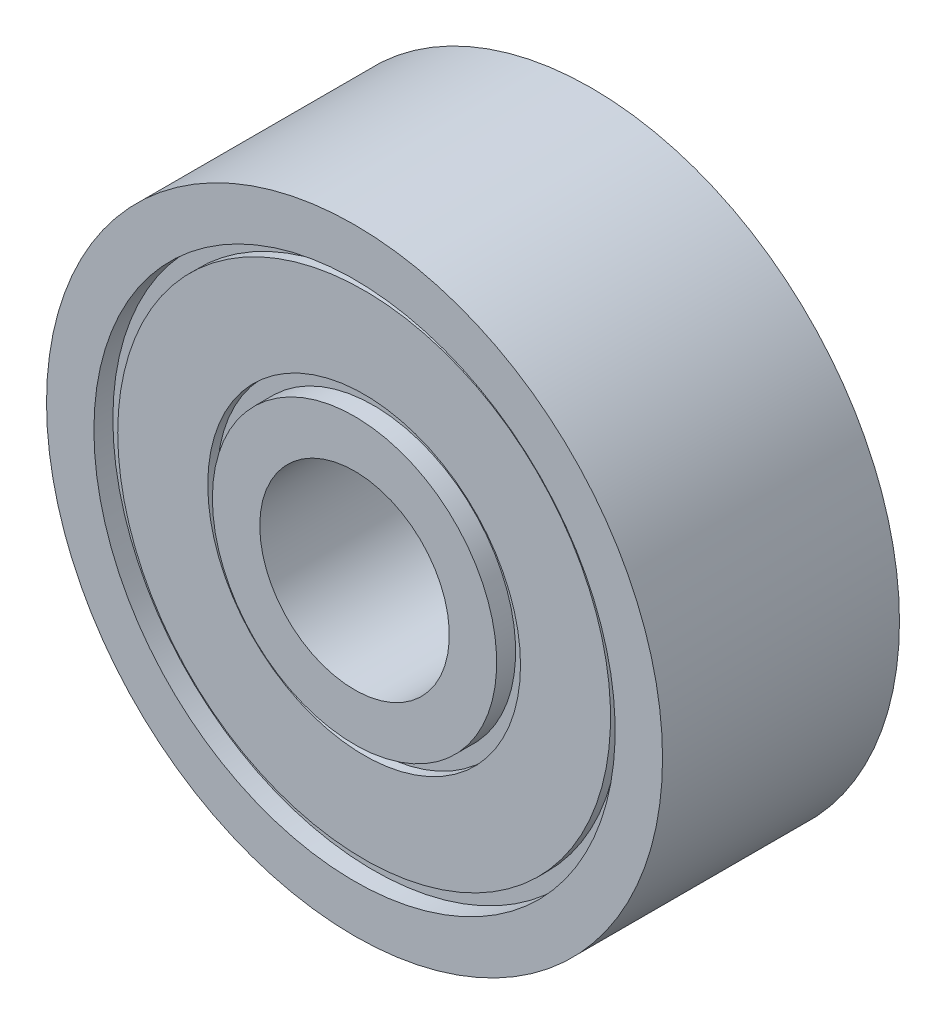
ISO-10303-21;
HEADER;
FILE_DESCRIPTION(('STEP AP214'),'2;1');
FILE_NAME('part.step','',(''),(''),'','','');
FILE_SCHEMA(('AUTOMOTIVE_DESIGN { 1 0 10303 214 1 1 1 1 }'));
ENDSEC;
DATA;
#1=APPLICATION_CONTEXT('core data for automotive mechanical design processes');
#2=APPLICATION_PROTOCOL_DEFINITION('international standard','automotive_design',2000,#1);
#3=PRODUCT_CONTEXT('',#1,'mechanical');
#4=PRODUCT('Part','Part','',(#3));
#5=PRODUCT_RELATED_PRODUCT_CATEGORY('part','',(#4));
#6=PRODUCT_DEFINITION_FORMATION('','',#4);
#7=PRODUCT_DEFINITION_CONTEXT('part definition',#1,'design');
#8=PRODUCT_DEFINITION('design','',#6,#7);
#9=PRODUCT_DEFINITION_SHAPE('','',#8);
#10=(LENGTH_UNIT() NAMED_UNIT(*) SI_UNIT(.MILLI.,.METRE.));
#11=(NAMED_UNIT(*) PLANE_ANGLE_UNIT() SI_UNIT($,.RADIAN.));
#12=(NAMED_UNIT(*) SI_UNIT($,.STERADIAN.) SOLID_ANGLE_UNIT());
#13=UNCERTAINTY_MEASURE_WITH_UNIT(LENGTH_MEASURE(1.E-05),#10,'distance_accuracy_value','');
#14=(GEOMETRIC_REPRESENTATION_CONTEXT(3) GLOBAL_UNCERTAINTY_ASSIGNED_CONTEXT((#13)) GLOBAL_UNIT_ASSIGNED_CONTEXT((#10,
#11,#12)) REPRESENTATION_CONTEXT('',''));
#15=CARTESIAN_POINT('',(0.,0.,0.));
#16=DIRECTION('',(0.,0.,1.));
#17=DIRECTION('',(1.,0.,0.));
#18=AXIS2_PLACEMENT_3D('',#15,#16,#17);
#19=CARTESIAN_POINT('',(0.,0.,7.));
#20=DIRECTION('',(0.,0.,-1.));
#21=DIRECTION('',(-1.,0.,0.));
#22=AXIS2_PLACEMENT_3D('',#19,#20,#21);
#23=PLANE('',#22);
#24=CARTESIAN_POINT('',(0.,0.,7.));
#25=DIRECTION('',(0.,0.,1.));
#26=DIRECTION('',(-1.,0.,0.));
#27=AXIS2_PLACEMENT_3D('',#24,#25,#26);
#28=CIRCLE('',#27,6.4999997);
#29=CARTESIAN_POINT('',(-6.4999997,0.,7.));
#30=VERTEX_POINT('',#29);
#31=EDGE_CURVE('E43',#30,#30,#28,.T.);
#32=ORIENTED_EDGE('',*,*,#31,.T.);
#33=EDGE_LOOP('',(#32));
#34=FACE_BOUND('',#33,.T.);
#35=CARTESIAN_POINT('',(0.,0.,7.));
#36=DIRECTION('',(0.,0.,-1.));
#37=DIRECTION('',(-1.,0.,0.));
#38=AXIS2_PLACEMENT_3D('',#35,#36,#37);
#39=CIRCLE('',#38,5.49999916);
#40=CARTESIAN_POINT('',(-5.49999916,0.,7.));
#41=VERTEX_POINT('',#40);
#42=EDGE_CURVE('E91',#41,#41,#39,.T.);
#43=ORIENTED_EDGE('',*,*,#42,.T.);
#44=EDGE_LOOP('',(#43));
#45=FACE_BOUND('',#44,.T.);
#46=ADVANCED_FACE('F39',(#34,#45),#23,.F.);
#47=CARTESIAN_POINT('',(0.,0.,2.00001));
#48=DIRECTION('',(0.,0.,1.));
#49=DIRECTION('',(1.,0.,0.));
#50=AXIS2_PLACEMENT_3D('',#47,#48,#49);
#51=CYLINDRICAL_SURFACE('',#50,6.4999997);
#52=CARTESIAN_POINT('',(0.,0.,2.00001));
#53=DIRECTION('',(0.,0.,1.));
#54=DIRECTION('',(-1.,0.,0.));
#55=AXIS2_PLACEMENT_3D('',#52,#53,#54);
#56=CIRCLE('',#55,6.4999997);
#57=CARTESIAN_POINT('',(-6.4999997,0.,2.00001));
#58=VERTEX_POINT('',#57);
#59=EDGE_CURVE('E10',#58,#58,#56,.T.);
#60=ORIENTED_EDGE('',*,*,#59,.T.);
#61=EDGE_LOOP('',(#60));
#62=FACE_BOUND('',#61,.T.);
#63=ORIENTED_EDGE('',*,*,#31,.F.);
#64=EDGE_LOOP('',(#63));
#65=FACE_BOUND('',#64,.T.);
#66=ADVANCED_FACE('F41',(#62,#65),#51,.T.);
#67=CARTESIAN_POINT('',(0.,0.,2.00001));
#68=DIRECTION('',(0.,0.,-1.));
#69=DIRECTION('',(-1.,0.,0.));
#70=AXIS2_PLACEMENT_3D('',#67,#68,#69);
#71=PLANE('',#70);
#72=CARTESIAN_POINT('',(0.,0.,2.00001));
#73=DIRECTION('',(0.,0.,-1.));
#74=DIRECTION('',(-1.,0.,0.));
#75=AXIS2_PLACEMENT_3D('',#72,#73,#74);
#76=CIRCLE('',#75,5.49999916);
#77=CARTESIAN_POINT('',(-5.49999916,0.,2.00001));
#78=VERTEX_POINT('',#77);
#79=EDGE_CURVE('E102',#78,#78,#76,.T.);
#80=ORIENTED_EDGE('',*,*,#79,.F.);
#81=EDGE_LOOP('',(#80));
#82=FACE_BOUND('',#81,.T.);
#83=ORIENTED_EDGE('',*,*,#59,.F.);
#84=EDGE_LOOP('',(#83));
#85=FACE_BOUND('',#84,.T.);
#86=ADVANCED_FACE('F142',(#82,#85),#71,.T.);
#87=CARTESIAN_POINT('',(0.,0.,2.00001));
#88=DIRECTION('',(0.,0.,-1.));
#89=DIRECTION('',(-1.,0.,0.));
#90=AXIS2_PLACEMENT_3D('',#87,#88,#89);
#91=CYLINDRICAL_SURFACE('',#90,5.49999916);
#92=CARTESIAN_POINT('',(0.,0.,6.6000008));
#93=DIRECTION('',(0.,0.,-1.));
#94=DIRECTION('',(-1.,0.,0.));
#95=AXIS2_PLACEMENT_3D('',#92,#93,#94);
#96=CIRCLE('',#95,5.49999916);
#97=CARTESIAN_POINT('',(-5.49999916,0.,6.6000008));
#98=VERTEX_POINT('',#97);
#99=EDGE_CURVE('E62',#98,#98,#96,.T.);
#100=ORIENTED_EDGE('',*,*,#99,.T.);
#101=EDGE_LOOP('',(#100));
#102=FACE_BOUND('',#101,.T.);
#103=ORIENTED_EDGE('',*,*,#42,.F.);
#104=EDGE_LOOP('',(#103));
#105=FACE_BOUND('',#104,.T.);
#106=ADVANCED_FACE('F197',(#102,#105),#91,.F.);
#107=CARTESIAN_POINT('',(5.49999916,0.,6.6000008));
#108=DIRECTION('',(0.,0.,1.));
#109=DIRECTION('',(1.,0.,0.));
#110=AXIS2_PLACEMENT_3D('',#107,#108,#109);
#111=PLANE('',#110);
#112=CARTESIAN_POINT('',(0.,0.,6.6000008));
#113=DIRECTION('',(0.,0.,-1.));
#114=DIRECTION('',(-1.,0.,0.));
#115=AXIS2_PLACEMENT_3D('',#112,#113,#114);
#116=CIRCLE('',#115,5.19999976);
#117=CARTESIAN_POINT('',(-5.19999976,0.,6.6000008));
#118=VERTEX_POINT('',#117);
#119=EDGE_CURVE('E67',#118,#118,#116,.T.);
#120=ORIENTED_EDGE('',*,*,#119,.T.);
#121=EDGE_LOOP('',(#120));
#122=FACE_BOUND('',#121,.T.);
#123=ORIENTED_EDGE('',*,*,#99,.F.);
#124=EDGE_LOOP('',(#123));
#125=FACE_BOUND('',#124,.T.);
#126=ADVANCED_FACE('F191',(#122,#125),#111,.T.);
#127=CARTESIAN_POINT('',(0.,0.,2.00001));
#128=DIRECTION('',(0.,0.,-1.));
#129=DIRECTION('',(-1.,0.,0.));
#130=AXIS2_PLACEMENT_3D('',#127,#128,#129);
#131=CYLINDRICAL_SURFACE('',#130,5.19999976);
#132=CARTESIAN_POINT('',(0.,0.,6.79735338166822));
#133=DIRECTION('',(0.,0.,-1.));
#134=DIRECTION('',(-1.,0.,0.));
#135=AXIS2_PLACEMENT_3D('',#132,#133,#134);
#136=CIRCLE('',#135,5.19999976);
#137=CARTESIAN_POINT('',(-5.19999976,0.,6.79735338166822));
#138=VERTEX_POINT('',#137);
#139=EDGE_CURVE('E71',#138,#138,#136,.T.);
#140=ORIENTED_EDGE('',*,*,#139,.T.);
#141=EDGE_LOOP('',(#140));
#142=FACE_BOUND('',#141,.T.);
#143=ORIENTED_EDGE('',*,*,#119,.F.);
#144=EDGE_LOOP('',(#143));
#145=FACE_BOUND('',#144,.T.);
#146=ADVANCED_FACE('F185',(#142,#145),#131,.T.);
#147=CARTESIAN_POINT('',(5.19999976,0.,6.79735338166822));
#148=DIRECTION('',(0.,0.,1.));
#149=DIRECTION('',(1.,0.,0.));
#150=AXIS2_PLACEMENT_3D('',#147,#148,#149);
#151=PLANE('',#150);
#152=CARTESIAN_POINT('',(0.,0.,6.79735338166822));
#153=DIRECTION('',(0.,0.,-1.));
#154=DIRECTION('',(-1.,0.,0.));
#155=AXIS2_PLACEMENT_3D('',#152,#153,#154);
#156=CIRCLE('',#155,3.29999594);
#157=CARTESIAN_POINT('',(-3.29999594,0.,6.79735338166822));
#158=VERTEX_POINT('',#157);
#159=EDGE_CURVE('E75',#158,#158,#156,.T.);
#160=ORIENTED_EDGE('',*,*,#159,.T.);
#161=EDGE_LOOP('',(#160));
#162=FACE_BOUND('',#161,.T.);
#163=ORIENTED_EDGE('',*,*,#139,.F.);
#164=EDGE_LOOP('',(#163));
#165=FACE_BOUND('',#164,.T.);
#166=ADVANCED_FACE('F179',(#162,#165),#151,.T.);
#167=CARTESIAN_POINT('',(0.,0.,2.00001));
#168=DIRECTION('',(0.,0.,-1.));
#169=DIRECTION('',(-1.,0.,0.));
#170=AXIS2_PLACEMENT_3D('',#167,#168,#169);
#171=CYLINDRICAL_SURFACE('',#170,3.29999594);
#172=CARTESIAN_POINT('',(0.,0.,6.6000008));
#173=DIRECTION('',(0.,0.,-1.));
#174=DIRECTION('',(-1.,0.,0.));
#175=AXIS2_PLACEMENT_3D('',#172,#173,#174);
#176=CIRCLE('',#175,3.29999594);
#177=CARTESIAN_POINT('',(-3.29999594,0.,6.6000008));
#178=VERTEX_POINT('',#177);
#179=EDGE_CURVE('E79',#178,#178,#176,.T.);
#180=ORIENTED_EDGE('',*,*,#179,.T.);
#181=EDGE_LOOP('',(#180));
#182=FACE_BOUND('',#181,.T.);
#183=ORIENTED_EDGE('',*,*,#159,.F.);
#184=EDGE_LOOP('',(#183));
#185=FACE_BOUND('',#184,.T.);
#186=ADVANCED_FACE('F173',(#182,#185),#171,.F.);
#187=CARTESIAN_POINT('',(3.29999594,0.,6.6000008));
#188=DIRECTION('',(0.,0.,1.));
#189=DIRECTION('',(1.,0.,0.));
#190=AXIS2_PLACEMENT_3D('',#187,#188,#189);
#191=PLANE('',#190);
#192=CARTESIAN_POINT('',(0.,0.,6.6000008));
#193=DIRECTION('',(0.,0.,-1.));
#194=DIRECTION('',(-1.,0.,0.));
#195=AXIS2_PLACEMENT_3D('',#192,#193,#194);
#196=CIRCLE('',#195,2.99999654);
#197=CARTESIAN_POINT('',(-2.99999654,0.,6.6000008));
#198=VERTEX_POINT('',#197);
#199=EDGE_CURVE('E83',#198,#198,#196,.T.);
#200=ORIENTED_EDGE('',*,*,#199,.T.);
#201=EDGE_LOOP('',(#200));
#202=FACE_BOUND('',#201,.T.);
#203=ORIENTED_EDGE('',*,*,#179,.F.);
#204=EDGE_LOOP('',(#203));
#205=FACE_BOUND('',#204,.T.);
#206=ADVANCED_FACE('F167',(#202,#205),#191,.T.);
#207=CARTESIAN_POINT('',(0.,0.,2.00001));
#208=DIRECTION('',(0.,0.,-1.));
#209=DIRECTION('',(-1.,0.,0.));
#210=AXIS2_PLACEMENT_3D('',#207,#208,#209);
#211=CYLINDRICAL_SURFACE('',#210,2.99999654);
#212=CARTESIAN_POINT('',(0.,0.,7.));
#213=DIRECTION('',(0.,0.,-1.));
#214=DIRECTION('',(-1.,0.,0.));
#215=AXIS2_PLACEMENT_3D('',#212,#213,#214);
#216=CIRCLE('',#215,2.99999654);
#217=CARTESIAN_POINT('',(-2.99999654,0.,7.));
#218=VERTEX_POINT('',#217);
#219=EDGE_CURVE('E87',#218,#218,#216,.T.);
#220=ORIENTED_EDGE('',*,*,#219,.T.);
#221=EDGE_LOOP('',(#220));
#222=FACE_BOUND('',#221,.T.);
#223=ORIENTED_EDGE('',*,*,#199,.F.);
#224=EDGE_LOOP('',(#223));
#225=FACE_BOUND('',#224,.T.);
#226=ADVANCED_FACE('F164',(#222,#225),#211,.T.);
#227=CARTESIAN_POINT('',(3.29999594,0.,2.4000092));
#228=DIRECTION('',(0.,0.,-1.));
#229=DIRECTION('',(-1.,0.,0.));
#230=AXIS2_PLACEMENT_3D('',#227,#228,#229);
#231=PLANE('',#230);
#232=CARTESIAN_POINT('',(0.,0.,2.4000092));
#233=DIRECTION('',(0.,0.,-1.));
#234=DIRECTION('',(-1.,0.,0.));
#235=AXIS2_PLACEMENT_3D('',#232,#233,#234);
#236=CIRCLE('',#235,3.29999594);
#237=CARTESIAN_POINT('',(-3.29999594,0.,2.4000092));
#238=VERTEX_POINT('',#237);
#239=EDGE_CURVE('E66',#238,#238,#236,.T.);
#240=ORIENTED_EDGE('',*,*,#239,.T.);
#241=EDGE_LOOP('',(#240));
#242=FACE_BOUND('',#241,.T.);
#243=CARTESIAN_POINT('',(0.,0.,2.4000092));
#244=DIRECTION('',(0.,0.,-1.));
#245=DIRECTION('',(-1.,0.,0.));
#246=AXIS2_PLACEMENT_3D('',#243,#244,#245);
#247=CIRCLE('',#246,2.99999654);
#248=CARTESIAN_POINT('',(-2.99999654,0.,2.4000092));
#249=VERTEX_POINT('',#248);
#250=EDGE_CURVE('E58',#249,#249,#247,.T.);
#251=ORIENTED_EDGE('',*,*,#250,.F.);
#252=EDGE_LOOP('',(#251));
#253=FACE_BOUND('',#252,.T.);
#254=ADVANCED_FACE('F126',(#242,#253),#231,.T.);
#255=CARTESIAN_POINT('',(0.,0.,2.00001));
#256=DIRECTION('',(0.,0.,-1.));
#257=DIRECTION('',(-1.,0.,0.));
#258=AXIS2_PLACEMENT_3D('',#255,#256,#257);
#259=CYLINDRICAL_SURFACE('',#258,2.99999654);
#260=ORIENTED_EDGE('',*,*,#250,.T.);
#261=EDGE_LOOP('',(#260));
#262=FACE_BOUND('',#261,.T.);
#263=CARTESIAN_POINT('',(0.,0.,2.00001));
#264=DIRECTION('',(0.,0.,-1.));
#265=DIRECTION('',(-1.,0.,0.));
#266=AXIS2_PLACEMENT_3D('',#263,#264,#265);
#267=CIRCLE('',#266,2.99999654);
#268=CARTESIAN_POINT('',(-2.99999654,0.,2.00001));
#269=VERTEX_POINT('',#268);
#270=EDGE_CURVE('E98',#269,#269,#267,.T.);
#271=ORIENTED_EDGE('',*,*,#270,.F.);
#272=EDGE_LOOP('',(#271));
#273=FACE_BOUND('',#272,.T.);
#274=ADVANCED_FACE('F212',(#262,#273),#259,.T.);
#275=CARTESIAN_POINT('',(0.,0.,2.00001));
#276=DIRECTION('',(0.,0.,-1.));
#277=DIRECTION('',(-1.,0.,0.));
#278=AXIS2_PLACEMENT_3D('',#275,#276,#277);
#279=CYLINDRICAL_SURFACE('',#278,5.49999916);
#280=ORIENTED_EDGE('',*,*,#79,.T.);
#281=EDGE_LOOP('',(#280));
#282=FACE_BOUND('',#281,.T.);
#283=CARTESIAN_POINT('',(0.,0.,2.4000092));
#284=DIRECTION('',(0.,0.,-1.));
#285=DIRECTION('',(-1.,0.,0.));
#286=AXIS2_PLACEMENT_3D('',#283,#284,#285);
#287=CIRCLE('',#286,5.49999916);
#288=CARTESIAN_POINT('',(-5.49999916,0.,2.4000092));
#289=VERTEX_POINT('',#288);
#290=EDGE_CURVE('E106',#289,#289,#287,.T.);
#291=ORIENTED_EDGE('',*,*,#290,.F.);
#292=EDGE_LOOP('',(#291));
#293=FACE_BOUND('',#292,.T.);
#294=ADVANCED_FACE('F215',(#282,#293),#279,.F.);
#295=CARTESIAN_POINT('',(5.49999916,0.,2.4000092));
#296=DIRECTION('',(0.,0.,-1.));
#297=DIRECTION('',(-1.,0.,0.));
#298=AXIS2_PLACEMENT_3D('',#295,#296,#297);
#299=PLANE('',#298);
#300=ORIENTED_EDGE('',*,*,#290,.T.);
#301=EDGE_LOOP('',(#300));
#302=FACE_BOUND('',#301,.T.);
#303=CARTESIAN_POINT('',(0.,0.,2.4000092));
#304=DIRECTION('',(0.,0.,-1.));
#305=DIRECTION('',(-1.,0.,0.));
#306=AXIS2_PLACEMENT_3D('',#303,#304,#305);
#307=CIRCLE('',#306,5.19999976);
#308=CARTESIAN_POINT('',(-5.19999976,0.,2.4000092));
#309=VERTEX_POINT('',#308);
#310=EDGE_CURVE('E110',#309,#309,#307,.T.);
#311=ORIENTED_EDGE('',*,*,#310,.F.);
#312=EDGE_LOOP('',(#311));
#313=FACE_BOUND('',#312,.T.);
#314=ADVANCED_FACE('F219',(#302,#313),#299,.T.);
#315=CARTESIAN_POINT('',(0.,0.,2.00001));
#316=DIRECTION('',(0.,0.,-1.));
#317=DIRECTION('',(-1.,0.,0.));
#318=AXIS2_PLACEMENT_3D('',#315,#316,#317);
#319=CYLINDRICAL_SURFACE('',#318,5.19999976);
#320=ORIENTED_EDGE('',*,*,#310,.T.);
#321=EDGE_LOOP('',(#320));
#322=FACE_BOUND('',#321,.T.);
#323=CARTESIAN_POINT('',(0.,0.,2.20265661833178));
#324=DIRECTION('',(0.,0.,-1.));
#325=DIRECTION('',(-1.,0.,0.));
#326=AXIS2_PLACEMENT_3D('',#323,#324,#325);
#327=CIRCLE('',#326,5.19999976);
#328=CARTESIAN_POINT('',(-5.19999976,0.,2.20265661833178));
#329=VERTEX_POINT('',#328);
#330=EDGE_CURVE('E114',#329,#329,#327,.T.);
#331=ORIENTED_EDGE('',*,*,#330,.F.);
#332=EDGE_LOOP('',(#331));
#333=FACE_BOUND('',#332,.T.);
#334=ADVANCED_FACE('F143',(#322,#333),#319,.T.);
#335=CARTESIAN_POINT('',(5.19999976,0.,2.20265661833178));
#336=DIRECTION('',(0.,0.,-1.));
#337=DIRECTION('',(-1.,0.,0.));
#338=AXIS2_PLACEMENT_3D('',#335,#336,#337);
#339=PLANE('',#338);
#340=ORIENTED_EDGE('',*,*,#330,.T.);
#341=EDGE_LOOP('',(#340));
#342=FACE_BOUND('',#341,.T.);
#343=CARTESIAN_POINT('',(0.,0.,2.20265661833178));
#344=DIRECTION('',(0.,0.,-1.));
#345=DIRECTION('',(-1.,0.,0.));
#346=AXIS2_PLACEMENT_3D('',#343,#344,#345);
#347=CIRCLE('',#346,3.29999594);
#348=CARTESIAN_POINT('',(-3.29999594,0.,2.20265661833178));
#349=VERTEX_POINT('',#348);
#350=EDGE_CURVE('E118',#349,#349,#347,.T.);
#351=ORIENTED_EDGE('',*,*,#350,.F.);
#352=EDGE_LOOP('',(#351));
#353=FACE_BOUND('',#352,.T.);
#354=ADVANCED_FACE('F132',(#342,#353),#339,.T.);
#355=CARTESIAN_POINT('',(0.,0.,2.00001));
#356=DIRECTION('',(0.,0.,-1.));
#357=DIRECTION('',(-1.,0.,0.));
#358=AXIS2_PLACEMENT_3D('',#355,#356,#357);
#359=CYLINDRICAL_SURFACE('',#358,3.29999594);
#360=ORIENTED_EDGE('',*,*,#350,.T.);
#361=EDGE_LOOP('',(#360));
#362=FACE_BOUND('',#361,.T.);
#363=ORIENTED_EDGE('',*,*,#239,.F.);
#364=EDGE_LOOP('',(#363));
#365=FACE_BOUND('',#364,.T.);
#366=ADVANCED_FACE('F129',(#362,#365),#359,.F.);
#367=ORIENTED_EDGE('',*,*,#270,.T.);
#368=EDGE_LOOP('',(#367));
#369=FACE_BOUND('',#368,.T.);
#370=CARTESIAN_POINT('',(0.,0.,2.00001));
#371=DIRECTION('',(0.,0.,1.));
#372=DIRECTION('',(-1.,0.,0.));
#373=AXIS2_PLACEMENT_3D('',#370,#371,#372);
#374=CIRCLE('',#373,1.999996);
#375=CARTESIAN_POINT('',(-1.999996,0.,2.00001));
#376=VERTEX_POINT('',#375);
#377=EDGE_CURVE('E52',#376,#376,#374,.T.);
#378=ORIENTED_EDGE('',*,*,#377,.T.);
#379=EDGE_LOOP('',(#378));
#380=FACE_BOUND('',#379,.T.);
#381=ADVANCED_FACE('F131',(#369,#380),#71,.T.);
#382=CARTESIAN_POINT('',(0.,0.,2.00001));
#383=DIRECTION('',(0.,0.,1.));
#384=DIRECTION('',(1.,0.,0.));
#385=AXIS2_PLACEMENT_3D('',#382,#383,#384);
#386=CYLINDRICAL_SURFACE('',#385,1.999996);
#387=ORIENTED_EDGE('',*,*,#377,.F.);
#388=EDGE_LOOP('',(#387));
#389=FACE_BOUND('',#388,.T.);
#390=CARTESIAN_POINT('',(0.,0.,7.));
#391=DIRECTION('',(0.,0.,1.));
#392=DIRECTION('',(-1.,0.,0.));
#393=AXIS2_PLACEMENT_3D('',#390,#391,#392);
#394=CIRCLE('',#393,1.999996);
#395=CARTESIAN_POINT('',(-1.999996,0.,7.));
#396=VERTEX_POINT('',#395);
#397=EDGE_CURVE('E54',#396,#396,#394,.T.);
#398=ORIENTED_EDGE('',*,*,#397,.T.);
#399=EDGE_LOOP('',(#398));
#400=FACE_BOUND('',#399,.T.);
#401=ADVANCED_FACE('F139',(#389,#400),#386,.F.);
#402=ORIENTED_EDGE('',*,*,#397,.F.);
#403=EDGE_LOOP('',(#402));
#404=FACE_BOUND('',#403,.T.);
#405=ORIENTED_EDGE('',*,*,#219,.F.);
#406=EDGE_LOOP('',(#405));
#407=FACE_BOUND('',#406,.T.);
#408=ADVANCED_FACE('F148',(#404,#407),#23,.F.);
#409=CLOSED_SHELL('',(#46,#66,#86,#106,#126,#146,#166,#186,#206,#226,#254,#274,#294,#314,#334,
#354,#366,#381,#401,#408));
#410=MANIFOLD_SOLID_BREP('B2',#409);
#411=ADVANCED_BREP_SHAPE_REPRESENTATION('',(#18,#410),#14);
#412=SHAPE_DEFINITION_REPRESENTATION(#9,#411);
ENDSEC;
END-ISO-10303-21;
